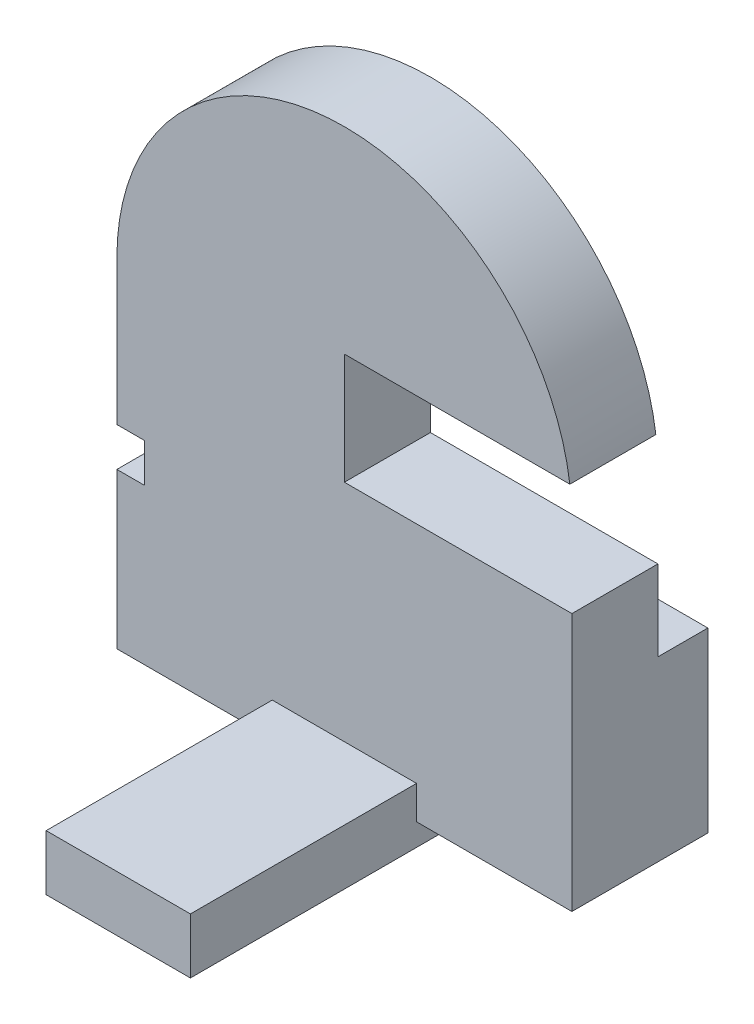
ISO-10303-21;
HEADER;
FILE_DESCRIPTION(('STEP AP214'),'2;1');
FILE_NAME('part.step','',(''),(''),'','','');
FILE_SCHEMA(('AUTOMOTIVE_DESIGN { 1 0 10303 214 1 1 1 1 }'));
ENDSEC;
DATA;
#1=APPLICATION_CONTEXT('core data for automotive mechanical design processes');
#2=APPLICATION_PROTOCOL_DEFINITION('international standard','automotive_design',2000,#1);
#3=PRODUCT_CONTEXT('',#1,'mechanical');
#4=PRODUCT('Part','Part','',(#3));
#5=PRODUCT_RELATED_PRODUCT_CATEGORY('part','',(#4));
#6=PRODUCT_DEFINITION_FORMATION('','',#4);
#7=PRODUCT_DEFINITION_CONTEXT('part definition',#1,'design');
#8=PRODUCT_DEFINITION('design','',#6,#7);
#9=PRODUCT_DEFINITION_SHAPE('','',#8);
#10=(LENGTH_UNIT() NAMED_UNIT(*) SI_UNIT(.MILLI.,.METRE.));
#11=(NAMED_UNIT(*) PLANE_ANGLE_UNIT() SI_UNIT($,.RADIAN.));
#12=(NAMED_UNIT(*) SI_UNIT($,.STERADIAN.) SOLID_ANGLE_UNIT());
#13=UNCERTAINTY_MEASURE_WITH_UNIT(LENGTH_MEASURE(1.E-05),#10,'distance_accuracy_value','');
#14=(GEOMETRIC_REPRESENTATION_CONTEXT(3) GLOBAL_UNCERTAINTY_ASSIGNED_CONTEXT((#13)) GLOBAL_UNIT_ASSIGNED_CONTEXT((#10,
#11,#12)) REPRESENTATION_CONTEXT('',''));
#15=CARTESIAN_POINT('',(0.,0.,0.));
#16=DIRECTION('',(0.,0.,1.));
#17=DIRECTION('',(1.,0.,0.));
#18=AXIS2_PLACEMENT_3D('',#15,#16,#17);
#19=CARTESIAN_POINT('',(-1.3,0.,-15.2));
#20=DIRECTION('',(0.,1.,0.));
#21=DIRECTION('',(0.,0.,1.));
#22=AXIS2_PLACEMENT_3D('',#19,#20,#21);
#23=PLANE('',#22);
#24=DIRECTION('',(0.,0.,1.));
#25=VECTOR('',#24,1.);
#26=CARTESIAN_POINT('',(1.3,0.,-15.2));
#27=LINE('',#26,#25);
#28=CARTESIAN_POINT('',(1.3,0.,-14.3));
#29=VERTEX_POINT('',#28);
#30=CARTESIAN_POINT('',(1.3,0.,-8.675));
#31=VERTEX_POINT('',#30);
#32=EDGE_CURVE('E237',#29,#31,#27,.T.);
#33=ORIENTED_EDGE('',*,*,#32,.T.);
#34=DIRECTION('',(1.,0.,0.));
#35=VECTOR('',#34,1.);
#36=CARTESIAN_POINT('',(-1.3,0.,-8.675));
#37=LINE('',#36,#35);
#38=CARTESIAN_POINT('',(-1.3,0.,-8.675));
#39=VERTEX_POINT('',#38);
#40=EDGE_CURVE('E243',#39,#31,#37,.T.);
#41=ORIENTED_EDGE('',*,*,#40,.F.);
#42=DIRECTION('',(0.,0.,-1.));
#43=VECTOR('',#42,1.);
#44=CARTESIAN_POINT('',(-1.3,0.,-15.2));
#45=LINE('',#44,#43);
#46=CARTESIAN_POINT('',(-1.3,0.,-14.3));
#47=VERTEX_POINT('',#46);
#48=EDGE_CURVE('E245',#39,#47,#45,.T.);
#49=ORIENTED_EDGE('',*,*,#48,.T.);
#50=DIRECTION('',(-1.,0.,0.));
#51=VECTOR('',#50,1.);
#52=CARTESIAN_POINT('',(0.,0.,-14.3));
#53=LINE('',#52,#51);
#54=EDGE_CURVE('E221',#29,#47,#53,.T.);
#55=ORIENTED_EDGE('',*,*,#54,.F.);
#56=EDGE_LOOP('',(#33,#41,#49,#55));
#57=FACE_BOUND('',#56,.T.);
#58=ADVANCED_FACE('F17',(#57),#23,.F.);
#59=CARTESIAN_POINT('',(-1.95,3.6,-14.3));
#60=DIRECTION('',(-1.,0.,0.));
#61=DIRECTION('',(0.,-1.,0.));
#62=AXIS2_PLACEMENT_3D('',#59,#60,#61);
#63=PLANE('',#62);
#64=DIRECTION('',(0.,0.,-1.));
#65=VECTOR('',#64,1.);
#66=CARTESIAN_POINT('',(-1.95,3.6,-14.3));
#67=LINE('',#66,#65);
#68=CARTESIAN_POINT('',(-1.95,3.6,-15.2));
#69=VERTEX_POINT('',#68);
#70=CARTESIAN_POINT('',(-1.95,3.6,-14.3));
#71=VERTEX_POINT('',#70);
#72=EDGE_CURVE('E276',#69,#71,#67,.F.);
#73=ORIENTED_EDGE('',*,*,#72,.T.);
#74=DIRECTION('',(0.,1.,0.));
#75=VECTOR('',#74,1.);
#76=CARTESIAN_POINT('',(-1.95,6.5,-14.3));
#77=LINE('',#76,#75);
#78=CARTESIAN_POINT('',(-1.95,0.4,-14.3));
#79=VERTEX_POINT('',#78);
#80=EDGE_CURVE('E220',#79,#71,#77,.T.);
#81=ORIENTED_EDGE('',*,*,#80,.F.);
#82=DIRECTION('',(0.,0.,1.));
#83=VECTOR('',#82,1.);
#84=CARTESIAN_POINT('',(-1.95,0.4,-14.3));
#85=LINE('',#84,#83);
#86=CARTESIAN_POINT('',(-1.95,0.4,-15.2));
#87=VERTEX_POINT('',#86);
#88=EDGE_CURVE('E281',#87,#79,#85,.T.);
#89=ORIENTED_EDGE('',*,*,#88,.F.);
#90=DIRECTION('',(0.,1.,0.));
#91=VECTOR('',#90,1.);
#92=CARTESIAN_POINT('',(-1.95,6.5,-15.2));
#93=LINE('',#92,#91);
#94=EDGE_CURVE('E226',#69,#87,#93,.F.);
#95=ORIENTED_EDGE('',*,*,#94,.F.);
#96=EDGE_LOOP('',(#73,#81,#89,#95));
#97=FACE_BOUND('',#96,.T.);
#98=ADVANCED_FACE('F476',(#97),#63,.F.);
#99=CARTESIAN_POINT('',(-4.1,3.6,-14.3));
#100=DIRECTION('',(0.,-1.,0.));
#101=DIRECTION('',(0.,0.,-1.));
#102=AXIS2_PLACEMENT_3D('',#99,#100,#101);
#103=PLANE('',#102);
#104=DIRECTION('',(0.,0.,-1.));
#105=VECTOR('',#104,1.);
#106=CARTESIAN_POINT('',(-4.1,3.6,-14.3));
#107=LINE('',#106,#105);
#108=CARTESIAN_POINT('',(-4.1,3.6,-14.3));
#109=VERTEX_POINT('',#108);
#110=CARTESIAN_POINT('',(-4.1,3.6,-15.2));
#111=VERTEX_POINT('',#110);
#112=EDGE_CURVE('E274',#109,#111,#107,.T.);
#113=ORIENTED_EDGE('',*,*,#112,.F.);
#114=DIRECTION('',(-1.,0.,0.));
#115=VECTOR('',#114,1.);
#116=CARTESIAN_POINT('',(0.,3.6,-14.3));
#117=LINE('',#116,#115);
#118=EDGE_CURVE('E216',#71,#109,#117,.T.);
#119=ORIENTED_EDGE('',*,*,#118,.F.);
#120=ORIENTED_EDGE('',*,*,#72,.F.);
#121=DIRECTION('',(-1.,0.,0.));
#122=VECTOR('',#121,1.);
#123=CARTESIAN_POINT('',(0.,3.6,-15.2));
#124=LINE('',#123,#122);
#125=EDGE_CURVE('E233',#111,#69,#124,.F.);
#126=ORIENTED_EDGE('',*,*,#125,.F.);
#127=EDGE_LOOP('',(#113,#119,#120,#126));
#128=FACE_BOUND('',#127,.T.);
#129=ADVANCED_FACE('F474',(#128),#103,.F.);
#130=CARTESIAN_POINT('',(4.1,3.6,-14.3));
#131=DIRECTION('',(0.,-1.,0.));
#132=DIRECTION('',(0.,0.,-1.));
#133=AXIS2_PLACEMENT_3D('',#130,#131,#132);
#134=PLANE('',#133);
#135=DIRECTION('',(0.,0.,1.));
#136=VECTOR('',#135,1.);
#137=CARTESIAN_POINT('',(1.95,3.6,-14.3));
#138=LINE('',#137,#136);
#139=CARTESIAN_POINT('',(1.95,3.6,-15.2));
#140=VERTEX_POINT('',#139);
#141=CARTESIAN_POINT('',(1.95,3.6,-14.3));
#142=VERTEX_POINT('',#141);
#143=EDGE_CURVE('E259',#140,#142,#138,.T.);
#144=ORIENTED_EDGE('',*,*,#143,.T.);
#145=DIRECTION('',(-1.,0.,0.));
#146=VECTOR('',#145,1.);
#147=CARTESIAN_POINT('',(0.,3.6,-14.3));
#148=LINE('',#147,#146);
#149=CARTESIAN_POINT('',(4.1,3.6,-14.3));
#150=VERTEX_POINT('',#149);
#151=EDGE_CURVE('E214',#150,#142,#148,.T.);
#152=ORIENTED_EDGE('',*,*,#151,.F.);
#153=DIRECTION('',(0.,0.,-1.));
#154=VECTOR('',#153,1.);
#155=CARTESIAN_POINT('',(4.1,3.6,-14.3));
#156=LINE('',#155,#154);
#157=CARTESIAN_POINT('',(4.1,3.6,-15.2));
#158=VERTEX_POINT('',#157);
#159=EDGE_CURVE('E271',#158,#150,#156,.F.);
#160=ORIENTED_EDGE('',*,*,#159,.F.);
#161=DIRECTION('',(-1.,0.,0.));
#162=VECTOR('',#161,1.);
#163=CARTESIAN_POINT('',(0.,3.6,-15.2));
#164=LINE('',#163,#162);
#165=EDGE_CURVE('E254',#140,#158,#164,.F.);
#166=ORIENTED_EDGE('',*,*,#165,.F.);
#167=EDGE_LOOP('',(#144,#152,#160,#166));
#168=FACE_BOUND('',#167,.T.);
#169=ADVANCED_FACE('F449',(#168),#134,.F.);
#170=CARTESIAN_POINT('',(1.95,3.6,-14.3));
#171=DIRECTION('',(1.,0.,0.));
#172=DIRECTION('',(0.,1.,0.));
#173=AXIS2_PLACEMENT_3D('',#170,#171,#172);
#174=PLANE('',#173);
#175=ORIENTED_EDGE('',*,*,#143,.F.);
#176=DIRECTION('',(0.,1.,0.));
#177=VECTOR('',#176,1.);
#178=CARTESIAN_POINT('',(1.95,6.5,-15.2));
#179=LINE('',#178,#177);
#180=CARTESIAN_POINT('',(1.95,0.4,-15.2));
#181=VERTEX_POINT('',#180);
#182=EDGE_CURVE('E257',#181,#140,#179,.T.);
#183=ORIENTED_EDGE('',*,*,#182,.F.);
#184=DIRECTION('',(0.,0.,1.));
#185=VECTOR('',#184,1.);
#186=CARTESIAN_POINT('',(1.95,0.4,-14.3));
#187=LINE('',#186,#185);
#188=CARTESIAN_POINT('',(1.95,0.4,-14.3));
#189=VERTEX_POINT('',#188);
#190=EDGE_CURVE('E268',#189,#181,#187,.F.);
#191=ORIENTED_EDGE('',*,*,#190,.F.);
#192=DIRECTION('',(0.,1.,0.));
#193=VECTOR('',#192,1.);
#194=CARTESIAN_POINT('',(1.95,6.5,-14.3));
#195=LINE('',#194,#193);
#196=EDGE_CURVE('E180',#142,#189,#195,.F.);
#197=ORIENTED_EDGE('',*,*,#196,.F.);
#198=EDGE_LOOP('',(#175,#183,#191,#197));
#199=FACE_BOUND('',#198,.T.);
#200=ADVANCED_FACE('F536',(#199),#174,.F.);
#201=CARTESIAN_POINT('',(0.,6.5,-15.2));
#202=DIRECTION('',(0.,0.,-1.));
#203=DIRECTION('',(-1.,0.,0.));
#204=AXIS2_PLACEMENT_3D('',#201,#202,#203);
#205=PLANE('',#204);
#206=DIRECTION('',(0.,-1.,0.));
#207=VECTOR('',#206,1.);
#208=CARTESIAN_POINT('',(4.1,5.05,-15.2));
#209=LINE('',#208,#207);
#210=CARTESIAN_POINT('',(4.1,0.4,-15.2));
#211=VERTEX_POINT('',#210);
#212=EDGE_CURVE('E345',#158,#211,#209,.T.);
#213=ORIENTED_EDGE('',*,*,#212,.T.);
#214=DIRECTION('',(1.,0.,0.));
#215=VECTOR('',#214,1.);
#216=CARTESIAN_POINT('',(4.1,0.4,-15.2));
#217=LINE('',#216,#215);
#218=EDGE_CURVE('E336',#211,#181,#217,.F.);
#219=ORIENTED_EDGE('',*,*,#218,.T.);
#220=ORIENTED_EDGE('',*,*,#182,.T.);
#221=ORIENTED_EDGE('',*,*,#165,.T.);
#222=EDGE_LOOP('',(#213,#219,#220,#221));
#223=FACE_BOUND('',#222,.T.);
#224=ADVANCED_FACE('F533',(#223),#205,.T.);
#225=CARTESIAN_POINT('',(-1.3,0.,-15.2));
#226=DIRECTION('',(1.,0.,0.));
#227=DIRECTION('',(0.,0.,-1.));
#228=AXIS2_PLACEMENT_3D('',#225,#226,#227);
#229=PLANE('',#228);
#230=ORIENTED_EDGE('',*,*,#48,.F.);
#231=DIRECTION('',(0.,1.,0.));
#232=VECTOR('',#231,1.);
#233=CARTESIAN_POINT('',(-1.3,1.,-8.675));
#234=LINE('',#233,#232);
#235=CARTESIAN_POINT('',(-1.3,1.,-8.675));
#236=VERTEX_POINT('',#235);
#237=EDGE_CURVE('E240',#236,#39,#234,.F.);
#238=ORIENTED_EDGE('',*,*,#237,.F.);
#239=DIRECTION('',(0.,0.,1.));
#240=VECTOR('',#239,1.);
#241=CARTESIAN_POINT('',(-1.3,1.,-8.675));
#242=LINE('',#241,#240);
#243=CARTESIAN_POINT('',(-1.3,1.,-12.75));
#244=VERTEX_POINT('',#243);
#245=EDGE_CURVE('E330',#244,#236,#242,.T.);
#246=ORIENTED_EDGE('',*,*,#245,.F.);
#247=DIRECTION('',(0.,1.,0.));
#248=VECTOR('',#247,1.);
#249=CARTESIAN_POINT('',(-1.3,0.,-12.75));
#250=LINE('',#249,#248);
#251=CARTESIAN_POINT('',(-1.3,0.4,-12.75));
#252=VERTEX_POINT('',#251);
#253=EDGE_CURVE('E248',#252,#244,#250,.T.);
#254=ORIENTED_EDGE('',*,*,#253,.F.);
#255=DIRECTION('',(0.,0.,-1.));
#256=VECTOR('',#255,1.);
#257=CARTESIAN_POINT('',(-1.3,0.4,-15.2));
#258=LINE('',#257,#256);
#259=CARTESIAN_POINT('',(-1.3,0.4,-14.3));
#260=VERTEX_POINT('',#259);
#261=EDGE_CURVE('E251',#260,#252,#258,.F.);
#262=ORIENTED_EDGE('',*,*,#261,.F.);
#263=DIRECTION('',(0.,1.,0.));
#264=VECTOR('',#263,1.);
#265=CARTESIAN_POINT('',(-1.3,6.5,-14.3));
#266=LINE('',#265,#264);
#267=EDGE_CURVE('E217',#47,#260,#266,.T.);
#268=ORIENTED_EDGE('',*,*,#267,.F.);
#269=EDGE_LOOP('',(#230,#238,#246,#254,#262,#268));
#270=FACE_BOUND('',#269,.T.);
#271=ADVANCED_FACE('F404',(#270),#229,.F.);
#272=CARTESIAN_POINT('',(-1.3,1.,-8.675));
#273=DIRECTION('',(0.,0.,1.));
#274=DIRECTION('',(1.,0.,0.));
#275=AXIS2_PLACEMENT_3D('',#272,#273,#274);
#276=PLANE('',#275);
#277=DIRECTION('',(1.,0.,0.));
#278=VECTOR('',#277,1.);
#279=CARTESIAN_POINT('',(-1.3,1.,-8.675));
#280=LINE('',#279,#278);
#281=CARTESIAN_POINT('',(1.3,1.,-8.675));
#282=VERTEX_POINT('',#281);
#283=EDGE_CURVE('E327',#236,#282,#280,.T.);
#284=ORIENTED_EDGE('',*,*,#283,.F.);
#285=ORIENTED_EDGE('',*,*,#237,.T.);
#286=ORIENTED_EDGE('',*,*,#40,.T.);
#287=DIRECTION('',(0.,1.,0.));
#288=VECTOR('',#287,1.);
#289=CARTESIAN_POINT('',(1.3,0.,-8.675));
#290=LINE('',#289,#288);
#291=EDGE_CURVE('E234',#31,#282,#290,.T.);
#292=ORIENTED_EDGE('',*,*,#291,.T.);
#293=EDGE_LOOP('',(#284,#285,#286,#292));
#294=FACE_BOUND('',#293,.T.);
#295=ADVANCED_FACE('F416',(#294),#276,.T.);
#296=CARTESIAN_POINT('',(1.3,0.,-15.2));
#297=DIRECTION('',(-1.,0.,0.));
#298=DIRECTION('',(0.,0.,1.));
#299=AXIS2_PLACEMENT_3D('',#296,#297,#298);
#300=PLANE('',#299);
#301=DIRECTION('',(0.,0.,1.));
#302=VECTOR('',#301,1.);
#303=CARTESIAN_POINT('',(1.3,0.4,-15.2));
#304=LINE('',#303,#302);
#305=CARTESIAN_POINT('',(1.3,0.4,-14.3));
#306=VERTEX_POINT('',#305);
#307=CARTESIAN_POINT('',(1.3,0.4,-12.75));
#308=VERTEX_POINT('',#307);
#309=EDGE_CURVE('E342',#306,#308,#304,.T.);
#310=ORIENTED_EDGE('',*,*,#309,.T.);
#311=DIRECTION('',(0.,1.,0.));
#312=VECTOR('',#311,1.);
#313=CARTESIAN_POINT('',(1.3,0.,-12.75));
#314=LINE('',#313,#312);
#315=CARTESIAN_POINT('',(1.3,1.,-12.75));
#316=VERTEX_POINT('',#315);
#317=EDGE_CURVE('E230',#316,#308,#314,.F.);
#318=ORIENTED_EDGE('',*,*,#317,.F.);
#319=DIRECTION('',(0.,0.,1.));
#320=VECTOR('',#319,1.);
#321=CARTESIAN_POINT('',(1.3,1.,-8.675));
#322=LINE('',#321,#320);
#323=EDGE_CURVE('E294',#282,#316,#322,.F.);
#324=ORIENTED_EDGE('',*,*,#323,.F.);
#325=ORIENTED_EDGE('',*,*,#291,.F.);
#326=ORIENTED_EDGE('',*,*,#32,.F.);
#327=DIRECTION('',(0.,1.,0.));
#328=VECTOR('',#327,1.);
#329=CARTESIAN_POINT('',(1.3,6.5,-14.3));
#330=LINE('',#329,#328);
#331=EDGE_CURVE('E223',#306,#29,#330,.F.);
#332=ORIENTED_EDGE('',*,*,#331,.F.);
#333=EDGE_LOOP('',(#310,#318,#324,#325,#326,#332));
#334=FACE_BOUND('',#333,.T.);
#335=ADVANCED_FACE('F461',(#334),#300,.F.);
#336=CARTESIAN_POINT('',(0.,6.5,-15.2));
#337=DIRECTION('',(0.,0.,-1.));
#338=DIRECTION('',(-1.,0.,0.));
#339=AXIS2_PLACEMENT_3D('',#336,#337,#338);
#340=PLANE('',#339);
#341=DIRECTION('',(1.,0.,0.));
#342=VECTOR('',#341,1.);
#343=CARTESIAN_POINT('',(-1.3,0.4,-15.2));
#344=LINE('',#343,#342);
#345=CARTESIAN_POINT('',(-4.1,0.4,-15.2));
#346=VERTEX_POINT('',#345);
#347=EDGE_CURVE('E293',#87,#346,#344,.F.);
#348=ORIENTED_EDGE('',*,*,#347,.T.);
#349=DIRECTION('',(0.,1.,0.));
#350=VECTOR('',#349,1.);
#351=CARTESIAN_POINT('',(-4.1,0.4,-15.2));
#352=LINE('',#351,#350);
#353=EDGE_CURVE('E209',#346,#111,#352,.T.);
#354=ORIENTED_EDGE('',*,*,#353,.T.);
#355=ORIENTED_EDGE('',*,*,#125,.T.);
#356=ORIENTED_EDGE('',*,*,#94,.T.);
#357=EDGE_LOOP('',(#348,#354,#355,#356));
#358=FACE_BOUND('',#357,.T.);
#359=ADVANCED_FACE('F469',(#358),#340,.T.);
#360=CARTESIAN_POINT('',(0.,6.5,-14.3));
#361=DIRECTION('',(0.,0.,-1.));
#362=DIRECTION('',(-1.,0.,0.));
#363=AXIS2_PLACEMENT_3D('',#360,#361,#362);
#364=PLANE('',#363);
#365=ORIENTED_EDGE('',*,*,#151,.T.);
#366=ORIENTED_EDGE('',*,*,#196,.T.);
#367=DIRECTION('',(1.,0.,0.));
#368=VECTOR('',#367,1.);
#369=CARTESIAN_POINT('',(4.1,0.4,-14.3));
#370=LINE('',#369,#368);
#371=EDGE_CURVE('E333',#189,#306,#370,.F.);
#372=ORIENTED_EDGE('',*,*,#371,.T.);
#373=ORIENTED_EDGE('',*,*,#331,.T.);
#374=ORIENTED_EDGE('',*,*,#54,.T.);
#375=ORIENTED_EDGE('',*,*,#267,.T.);
#376=DIRECTION('',(1.,0.,0.));
#377=VECTOR('',#376,1.);
#378=CARTESIAN_POINT('',(-1.3,0.4,-14.3));
#379=LINE('',#378,#377);
#380=EDGE_CURVE('E290',#260,#79,#379,.F.);
#381=ORIENTED_EDGE('',*,*,#380,.T.);
#382=ORIENTED_EDGE('',*,*,#80,.T.);
#383=ORIENTED_EDGE('',*,*,#118,.T.);
#384=DIRECTION('',(0.,1.,0.));
#385=VECTOR('',#384,1.);
#386=CARTESIAN_POINT('',(-4.1,0.4,-14.3));
#387=LINE('',#386,#385);
#388=CARTESIAN_POINT('',(-4.1,6.5,-14.3));
#389=VERTEX_POINT('',#388);
#390=EDGE_CURVE('E124',#109,#389,#387,.T.);
#391=ORIENTED_EDGE('',*,*,#390,.T.);
#392=CARTESIAN_POINT('',(0.,6.5,-14.3));
#393=DIRECTION('',(0.,0.,-1.));
#394=DIRECTION('',(-1.,0.,0.));
#395=AXIS2_PLACEMENT_3D('',#392,#393,#394);
#396=CIRCLE('',#395,4.1);
#397=CARTESIAN_POINT('',(4.06294228361682,7.05,-14.3));
#398=VERTEX_POINT('',#397);
#399=EDGE_CURVE('E20',#398,#389,#396,.F.);
#400=ORIENTED_EDGE('',*,*,#399,.F.);
#401=DIRECTION('',(1.,0.,0.));
#402=VECTOR('',#401,1.);
#403=CARTESIAN_POINT('',(0.,7.05,-14.3));
#404=LINE('',#403,#402);
#405=CARTESIAN_POINT('',(0.,7.05,-14.3));
#406=VERTEX_POINT('',#405);
#407=EDGE_CURVE('E120',#398,#406,#404,.F.);
#408=ORIENTED_EDGE('',*,*,#407,.T.);
#409=DIRECTION('',(0.,-1.,0.));
#410=VECTOR('',#409,1.);
#411=CARTESIAN_POINT('',(0.,7.05,-14.3));
#412=LINE('',#411,#410);
#413=CARTESIAN_POINT('',(0.,5.05,-14.3));
#414=VERTEX_POINT('',#413);
#415=EDGE_CURVE('E154',#406,#414,#412,.T.);
#416=ORIENTED_EDGE('',*,*,#415,.T.);
#417=DIRECTION('',(1.,0.,0.));
#418=VECTOR('',#417,1.);
#419=CARTESIAN_POINT('',(0.,5.05,-14.3));
#420=LINE('',#419,#418);
#421=CARTESIAN_POINT('',(4.1,5.05,-14.3));
#422=VERTEX_POINT('',#421);
#423=EDGE_CURVE('E353',#414,#422,#420,.T.);
#424=ORIENTED_EDGE('',*,*,#423,.T.);
#425=DIRECTION('',(0.,-1.,0.));
#426=VECTOR('',#425,1.);
#427=CARTESIAN_POINT('',(4.1,5.05,-14.3));
#428=LINE('',#427,#426);
#429=EDGE_CURVE('E348',#422,#150,#428,.T.);
#430=ORIENTED_EDGE('',*,*,#429,.T.);
#431=EDGE_LOOP('',(#365,#366,#372,#373,#374,#375,#381,#382,#383,#391,#400,#408,#416,#424,#430));
#432=FACE_BOUND('',#431,.T.);
#433=ADVANCED_FACE('F118',(#432),#364,.T.);
#434=CARTESIAN_POINT('',(-3.6,3.9,-13.75));
#435=DIRECTION('',(0.,0.,-1.));
#436=DIRECTION('',(0.,1.,0.));
#437=AXIS2_PLACEMENT_3D('',#434,#435,#436);
#438=PLANE('',#437);
#439=DIRECTION('',(1.,0.,0.));
#440=VECTOR('',#439,1.);
#441=CARTESIAN_POINT('',(-3.6,3.2,-13.75));
#442=LINE('',#441,#440);
#443=CARTESIAN_POINT('',(-4.1,3.2,-13.75));
#444=VERTEX_POINT('',#443);
#445=CARTESIAN_POINT('',(-3.6,3.2,-13.75));
#446=VERTEX_POINT('',#445);
#447=EDGE_CURVE('E191',#444,#446,#442,.T.);
#448=ORIENTED_EDGE('',*,*,#447,.T.);
#449=DIRECTION('',(0.,1.,0.));
#450=VECTOR('',#449,1.);
#451=CARTESIAN_POINT('',(-3.6,3.2,-13.75));
#452=LINE('',#451,#450);
#453=CARTESIAN_POINT('',(-3.6,3.9,-13.75));
#454=VERTEX_POINT('',#453);
#455=EDGE_CURVE('E174',#446,#454,#452,.T.);
#456=ORIENTED_EDGE('',*,*,#455,.T.);
#457=DIRECTION('',(1.,0.,0.));
#458=VECTOR('',#457,1.);
#459=CARTESIAN_POINT('',(-3.6,3.9,-13.75));
#460=LINE('',#459,#458);
#461=CARTESIAN_POINT('',(-4.1,3.9,-13.75));
#462=VERTEX_POINT('',#461);
#463=EDGE_CURVE('E129',#454,#462,#460,.F.);
#464=ORIENTED_EDGE('',*,*,#463,.T.);
#465=DIRECTION('',(0.,1.,0.));
#466=VECTOR('',#465,1.);
#467=CARTESIAN_POINT('',(-4.1,0.4,-13.75));
#468=LINE('',#467,#466);
#469=EDGE_CURVE('E162',#462,#444,#468,.F.);
#470=ORIENTED_EDGE('',*,*,#469,.T.);
#471=EDGE_LOOP('',(#448,#456,#464,#470));
#472=FACE_BOUND('',#471,.T.);
#473=ADVANCED_FACE('F518',(#472),#438,.F.);
#474=CARTESIAN_POINT('',(-3.6,3.9,-12.75));
#475=DIRECTION('',(0.,1.,0.));
#476=DIRECTION('',(0.,0.,1.));
#477=AXIS2_PLACEMENT_3D('',#474,#475,#476);
#478=PLANE('',#477);
#479=ORIENTED_EDGE('',*,*,#463,.F.);
#480=DIRECTION('',(0.,0.,-1.));
#481=VECTOR('',#480,1.);
#482=CARTESIAN_POINT('',(-3.6,3.9,-12.75));
#483=LINE('',#482,#481);
#484=CARTESIAN_POINT('',(-3.6,3.9,-12.75));
#485=VERTEX_POINT('',#484);
#486=EDGE_CURVE('E169',#454,#485,#483,.F.);
#487=ORIENTED_EDGE('',*,*,#486,.T.);
#488=DIRECTION('',(-1.,0.,0.));
#489=VECTOR('',#488,1.);
#490=CARTESIAN_POINT('',(0.,3.9,-12.75));
#491=LINE('',#490,#489);
#492=CARTESIAN_POINT('',(-4.1,3.9,-12.75));
#493=VERTEX_POINT('',#492);
#494=EDGE_CURVE('E165',#485,#493,#491,.T.);
#495=ORIENTED_EDGE('',*,*,#494,.T.);
#496=DIRECTION('',(0.,0.,-1.));
#497=VECTOR('',#496,1.);
#498=CARTESIAN_POINT('',(-4.1,3.9,-15.2));
#499=LINE('',#498,#497);
#500=EDGE_CURVE('E159',#493,#462,#499,.T.);
#501=ORIENTED_EDGE('',*,*,#500,.T.);
#502=EDGE_LOOP('',(#479,#487,#495,#501));
#503=FACE_BOUND('',#502,.T.);
#504=ADVANCED_FACE('F515',(#503),#478,.F.);
#505=CARTESIAN_POINT('',(0.,6.5,-15.2));
#506=DIRECTION('',(0.,0.,-1.));
#507=DIRECTION('',(-1.,0.,0.));
#508=AXIS2_PLACEMENT_3D('',#505,#506,#507);
#509=CYLINDRICAL_SURFACE('',#508,4.1);
#510=CARTESIAN_POINT('',(0.,6.5,-12.75));
#511=DIRECTION('',(0.,0.,-1.));
#512=DIRECTION('',(-1.,0.,0.));
#513=AXIS2_PLACEMENT_3D('',#510,#511,#512);
#514=CIRCLE('',#513,4.1);
#515=CARTESIAN_POINT('',(-4.1,6.5,-12.75));
#516=VERTEX_POINT('',#515);
#517=CARTESIAN_POINT('',(4.06294228361682,7.05,-12.75));
#518=VERTEX_POINT('',#517);
#519=EDGE_CURVE('E140',#516,#518,#514,.T.);
#520=ORIENTED_EDGE('',*,*,#519,.T.);
#521=DIRECTION('',(0.,0.,1.));
#522=VECTOR('',#521,1.);
#523=CARTESIAN_POINT('',(4.062942283617,7.05,-15.2));
#524=LINE('',#523,#522);
#525=EDGE_CURVE('E128',#518,#398,#524,.F.);
#526=ORIENTED_EDGE('',*,*,#525,.T.);
#527=ORIENTED_EDGE('',*,*,#399,.T.);
#528=DIRECTION('',(0.,0.,-1.));
#529=VECTOR('',#528,1.);
#530=CARTESIAN_POINT('',(-4.1,6.5,-15.2));
#531=LINE('',#530,#529);
#532=EDGE_CURVE('E157',#389,#516,#531,.F.);
#533=ORIENTED_EDGE('',*,*,#532,.T.);
#534=EDGE_LOOP('',(#520,#526,#527,#533));
#535=FACE_BOUND('',#534,.T.);
#536=ADVANCED_FACE('F138',(#535),#509,.T.);
#537=CARTESIAN_POINT('',(0.,7.05,-15.2));
#538=DIRECTION('',(0.,1.,0.));
#539=DIRECTION('',(0.,0.,1.));
#540=AXIS2_PLACEMENT_3D('',#537,#538,#539);
#541=PLANE('',#540);
#542=ORIENTED_EDGE('',*,*,#525,.F.);
#543=DIRECTION('',(-1.,0.,0.));
#544=VECTOR('',#543,1.);
#545=CARTESIAN_POINT('',(0.,7.05,-12.75));
#546=LINE('',#545,#544);
#547=CARTESIAN_POINT('',(0.,7.05,-12.75));
#548=VERTEX_POINT('',#547);
#549=EDGE_CURVE('E150',#518,#548,#546,.T.);
#550=ORIENTED_EDGE('',*,*,#549,.T.);
#551=DIRECTION('',(0.,0.,1.));
#552=VECTOR('',#551,1.);
#553=CARTESIAN_POINT('',(0.,7.05,-15.2));
#554=LINE('',#553,#552);
#555=EDGE_CURVE('E135',#548,#406,#554,.F.);
#556=ORIENTED_EDGE('',*,*,#555,.T.);
#557=ORIENTED_EDGE('',*,*,#407,.F.);
#558=EDGE_LOOP('',(#542,#550,#556,#557));
#559=FACE_BOUND('',#558,.T.);
#560=ADVANCED_FACE('F132',(#559),#541,.F.);
#561=CARTESIAN_POINT('',(0.,7.05,-15.2));
#562=DIRECTION('',(-1.,0.,0.));
#563=DIRECTION('',(0.,-1.,0.));
#564=AXIS2_PLACEMENT_3D('',#561,#562,#563);
#565=PLANE('',#564);
#566=ORIENTED_EDGE('',*,*,#555,.F.);
#567=DIRECTION('',(0.,1.,0.));
#568=VECTOR('',#567,1.);
#569=CARTESIAN_POINT('',(0.,6.5,-12.75));
#570=LINE('',#569,#568);
#571=CARTESIAN_POINT('',(0.,5.05,-12.75));
#572=VERTEX_POINT('',#571);
#573=EDGE_CURVE('E146',#548,#572,#570,.F.);
#574=ORIENTED_EDGE('',*,*,#573,.T.);
#575=DIRECTION('',(0.,0.,1.));
#576=VECTOR('',#575,1.);
#577=CARTESIAN_POINT('',(0.,5.05,-15.2));
#578=LINE('',#577,#576);
#579=EDGE_CURVE('E144',#572,#414,#578,.F.);
#580=ORIENTED_EDGE('',*,*,#579,.T.);
#581=ORIENTED_EDGE('',*,*,#415,.F.);
#582=EDGE_LOOP('',(#566,#574,#580,#581));
#583=FACE_BOUND('',#582,.T.);
#584=ADVANCED_FACE('F361',(#583),#565,.F.);
#585=CARTESIAN_POINT('',(0.,5.05,-15.2));
#586=DIRECTION('',(0.,-1.,0.));
#587=DIRECTION('',(1.,0.,0.));
#588=AXIS2_PLACEMENT_3D('',#585,#586,#587);
#589=PLANE('',#588);
#590=ORIENTED_EDGE('',*,*,#579,.F.);
#591=DIRECTION('',(-1.,0.,0.));
#592=VECTOR('',#591,1.);
#593=CARTESIAN_POINT('',(0.,5.05,-12.75));
#594=LINE('',#593,#592);
#595=CARTESIAN_POINT('',(4.1,5.05,-12.75));
#596=VERTEX_POINT('',#595);
#597=EDGE_CURVE('E149',#572,#596,#594,.F.);
#598=ORIENTED_EDGE('',*,*,#597,.T.);
#599=DIRECTION('',(0.,0.,1.));
#600=VECTOR('',#599,1.);
#601=CARTESIAN_POINT('',(4.1,5.05,-15.2));
#602=LINE('',#601,#600);
#603=EDGE_CURVE('E351',#596,#422,#602,.F.);
#604=ORIENTED_EDGE('',*,*,#603,.T.);
#605=ORIENTED_EDGE('',*,*,#423,.F.);
#606=EDGE_LOOP('',(#590,#598,#604,#605));
#607=FACE_BOUND('',#606,.T.);
#608=ADVANCED_FACE('F366',(#607),#589,.F.);
#609=CARTESIAN_POINT('',(4.1,5.05,-15.2));
#610=DIRECTION('',(-1.,0.,0.));
#611=DIRECTION('',(0.,-1.,0.));
#612=AXIS2_PLACEMENT_3D('',#609,#610,#611);
#613=PLANE('',#612);
#614=ORIENTED_EDGE('',*,*,#159,.T.);
#615=ORIENTED_EDGE('',*,*,#429,.F.);
#616=ORIENTED_EDGE('',*,*,#603,.F.);
#617=DIRECTION('',(0.,1.,0.));
#618=VECTOR('',#617,1.);
#619=CARTESIAN_POINT('',(4.1,6.5,-12.75));
#620=LINE('',#619,#618);
#621=CARTESIAN_POINT('',(4.1,0.4,-12.75));
#622=VERTEX_POINT('',#621);
#623=EDGE_CURVE('E375',#596,#622,#620,.F.);
#624=ORIENTED_EDGE('',*,*,#623,.T.);
#625=DIRECTION('',(0.,0.,1.));
#626=VECTOR('',#625,1.);
#627=CARTESIAN_POINT('',(4.1,0.4,-15.2));
#628=LINE('',#627,#626);
#629=EDGE_CURVE('E339',#622,#211,#628,.F.);
#630=ORIENTED_EDGE('',*,*,#629,.T.);
#631=ORIENTED_EDGE('',*,*,#212,.F.);
#632=EDGE_LOOP('',(#614,#615,#616,#624,#630,#631));
#633=FACE_BOUND('',#632,.T.);
#634=ADVANCED_FACE('F445',(#633),#613,.F.);
#635=CARTESIAN_POINT('',(4.1,0.4,-15.2));
#636=DIRECTION('',(0.,1.,0.));
#637=DIRECTION('',(0.,0.,1.));
#638=AXIS2_PLACEMENT_3D('',#635,#636,#637);
#639=PLANE('',#638);
#640=ORIENTED_EDGE('',*,*,#190,.T.);
#641=ORIENTED_EDGE('',*,*,#218,.F.);
#642=ORIENTED_EDGE('',*,*,#629,.F.);
#643=DIRECTION('',(-1.,0.,0.));
#644=VECTOR('',#643,1.);
#645=CARTESIAN_POINT('',(0.,0.4,-12.75));
#646=LINE('',#645,#644);
#647=EDGE_CURVE('E377',#622,#308,#646,.T.);
#648=ORIENTED_EDGE('',*,*,#647,.T.);
#649=ORIENTED_EDGE('',*,*,#309,.F.);
#650=ORIENTED_EDGE('',*,*,#371,.F.);
#651=EDGE_LOOP('',(#640,#641,#642,#648,#649,#650));
#652=FACE_BOUND('',#651,.T.);
#653=ADVANCED_FACE('F454',(#652),#639,.F.);
#654=CARTESIAN_POINT('',(-1.3,1.,-8.675));
#655=DIRECTION('',(0.,1.,0.));
#656=DIRECTION('',(0.,0.,1.));
#657=AXIS2_PLACEMENT_3D('',#654,#655,#656);
#658=PLANE('',#657);
#659=ORIENTED_EDGE('',*,*,#283,.T.);
#660=ORIENTED_EDGE('',*,*,#323,.T.);
#661=DIRECTION('',(-1.,0.,0.));
#662=VECTOR('',#661,1.);
#663=CARTESIAN_POINT('',(0.,1.,-12.75));
#664=LINE('',#663,#662);
#665=EDGE_CURVE('E382',#316,#244,#664,.T.);
#666=ORIENTED_EDGE('',*,*,#665,.T.);
#667=ORIENTED_EDGE('',*,*,#245,.T.);
#668=EDGE_LOOP('',(#659,#660,#666,#667));
#669=FACE_BOUND('',#668,.T.);
#670=ADVANCED_FACE('F422',(#669),#658,.T.);
#671=CARTESIAN_POINT('',(-1.3,0.4,-15.2));
#672=DIRECTION('',(0.,1.,0.));
#673=DIRECTION('',(0.,0.,1.));
#674=AXIS2_PLACEMENT_3D('',#671,#672,#673);
#675=PLANE('',#674);
#676=ORIENTED_EDGE('',*,*,#88,.T.);
#677=ORIENTED_EDGE('',*,*,#380,.F.);
#678=ORIENTED_EDGE('',*,*,#261,.T.);
#679=DIRECTION('',(-1.,0.,0.));
#680=VECTOR('',#679,1.);
#681=CARTESIAN_POINT('',(0.,0.4,-12.75));
#682=LINE('',#681,#680);
#683=CARTESIAN_POINT('',(-4.1,0.4,-12.75));
#684=VERTEX_POINT('',#683);
#685=EDGE_CURVE('E385',#252,#684,#682,.T.);
#686=ORIENTED_EDGE('',*,*,#685,.T.);
#687=DIRECTION('',(0.,0.,-1.));
#688=VECTOR('',#687,1.);
#689=CARTESIAN_POINT('',(-4.1,0.4,-15.2));
#690=LINE('',#689,#688);
#691=EDGE_CURVE('E303',#684,#346,#690,.T.);
#692=ORIENTED_EDGE('',*,*,#691,.T.);
#693=ORIENTED_EDGE('',*,*,#347,.F.);
#694=EDGE_LOOP('',(#676,#677,#678,#686,#692,#693));
#695=FACE_BOUND('',#694,.T.);
#696=ADVANCED_FACE('F398',(#695),#675,.F.);
#697=CARTESIAN_POINT('',(-4.1,0.4,-15.2));
#698=DIRECTION('',(1.,0.,0.));
#699=DIRECTION('',(0.,0.,-1.));
#700=AXIS2_PLACEMENT_3D('',#697,#698,#699);
#701=PLANE('',#700);
#702=DIRECTION('',(0.,0.,1.));
#703=VECTOR('',#702,1.);
#704=CARTESIAN_POINT('',(-4.1,3.2,-12.75));
#705=LINE('',#704,#703);
#706=CARTESIAN_POINT('',(-4.1,3.2,-12.75));
#707=VERTEX_POINT('',#706);
#708=EDGE_CURVE('E188',#707,#444,#705,.F.);
#709=ORIENTED_EDGE('',*,*,#708,.T.);
#710=ORIENTED_EDGE('',*,*,#469,.F.);
#711=ORIENTED_EDGE('',*,*,#500,.F.);
#712=DIRECTION('',(0.,1.,0.));
#713=VECTOR('',#712,1.);
#714=CARTESIAN_POINT('',(-4.1,6.5,-12.75));
#715=LINE('',#714,#713);
#716=EDGE_CURVE('E168',#493,#516,#715,.T.);
#717=ORIENTED_EDGE('',*,*,#716,.T.);
#718=ORIENTED_EDGE('',*,*,#532,.F.);
#719=ORIENTED_EDGE('',*,*,#390,.F.);
#720=ORIENTED_EDGE('',*,*,#112,.T.);
#721=ORIENTED_EDGE('',*,*,#353,.F.);
#722=ORIENTED_EDGE('',*,*,#691,.F.);
#723=DIRECTION('',(0.,1.,0.));
#724=VECTOR('',#723,1.);
#725=CARTESIAN_POINT('',(-4.1,6.5,-12.75));
#726=LINE('',#725,#724);
#727=EDGE_CURVE('E197',#684,#707,#726,.T.);
#728=ORIENTED_EDGE('',*,*,#727,.T.);
#729=EDGE_LOOP('',(#709,#710,#711,#717,#718,#719,#720,#721,#722,#728));
#730=FACE_BOUND('',#729,.T.);
#731=ADVANCED_FACE('F391',(#730),#701,.F.);
#732=CARTESIAN_POINT('',(-3.6,3.2,-12.75));
#733=DIRECTION('',(0.,-1.,0.));
#734=DIRECTION('',(1.,0.,0.));
#735=AXIS2_PLACEMENT_3D('',#732,#733,#734);
#736=PLANE('',#735);
#737=DIRECTION('',(-1.,0.,0.));
#738=VECTOR('',#737,1.);
#739=CARTESIAN_POINT('',(0.,3.2,-12.75));
#740=LINE('',#739,#738);
#741=CARTESIAN_POINT('',(-3.6,3.2,-12.75));
#742=VERTEX_POINT('',#741);
#743=EDGE_CURVE('E26',#707,#742,#740,.F.);
#744=ORIENTED_EDGE('',*,*,#743,.T.);
#745=DIRECTION('',(0.,0.,-1.));
#746=VECTOR('',#745,1.);
#747=CARTESIAN_POINT('',(-3.6,3.2,-12.75));
#748=LINE('',#747,#746);
#749=EDGE_CURVE('E34',#742,#446,#748,.T.);
#750=ORIENTED_EDGE('',*,*,#749,.T.);
#751=ORIENTED_EDGE('',*,*,#447,.F.);
#752=ORIENTED_EDGE('',*,*,#708,.F.);
#753=EDGE_LOOP('',(#744,#750,#751,#752));
#754=FACE_BOUND('',#753,.T.);
#755=ADVANCED_FACE('F491',(#754),#736,.F.);
#756=CARTESIAN_POINT('',(-3.6,3.2,-12.75));
#757=DIRECTION('',(1.,0.,0.));
#758=DIRECTION('',(0.,0.,-1.));
#759=AXIS2_PLACEMENT_3D('',#756,#757,#758);
#760=PLANE('',#759);
#761=ORIENTED_EDGE('',*,*,#486,.F.);
#762=ORIENTED_EDGE('',*,*,#455,.F.);
#763=ORIENTED_EDGE('',*,*,#749,.F.);
#764=DIRECTION('',(0.,1.,0.));
#765=VECTOR('',#764,1.);
#766=CARTESIAN_POINT('',(-3.6,6.5,-12.75));
#767=LINE('',#766,#765);
#768=EDGE_CURVE('E11',#742,#485,#767,.T.);
#769=ORIENTED_EDGE('',*,*,#768,.T.);
#770=EDGE_LOOP('',(#761,#762,#763,#769));
#771=FACE_BOUND('',#770,.T.);
#772=ADVANCED_FACE('F486',(#771),#760,.F.);
#773=CARTESIAN_POINT('',(0.,6.5,-12.75));
#774=DIRECTION('',(0.,0.,-1.));
#775=DIRECTION('',(-1.,0.,0.));
#776=AXIS2_PLACEMENT_3D('',#773,#774,#775);
#777=PLANE('',#776);
#778=ORIENTED_EDGE('',*,*,#743,.F.);
#779=ORIENTED_EDGE('',*,*,#727,.F.);
#780=ORIENTED_EDGE('',*,*,#685,.F.);
#781=ORIENTED_EDGE('',*,*,#253,.T.);
#782=ORIENTED_EDGE('',*,*,#665,.F.);
#783=ORIENTED_EDGE('',*,*,#317,.T.);
#784=ORIENTED_EDGE('',*,*,#647,.F.);
#785=ORIENTED_EDGE('',*,*,#623,.F.);
#786=ORIENTED_EDGE('',*,*,#597,.F.);
#787=ORIENTED_EDGE('',*,*,#573,.F.);
#788=ORIENTED_EDGE('',*,*,#549,.F.);
#789=ORIENTED_EDGE('',*,*,#519,.F.);
#790=ORIENTED_EDGE('',*,*,#716,.F.);
#791=ORIENTED_EDGE('',*,*,#494,.F.);
#792=ORIENTED_EDGE('',*,*,#768,.F.);
#793=EDGE_LOOP('',(#778,#779,#780,#781,#782,#783,#784,#785,#786,#787,#788,#789,#790,#791,#792));
#794=FACE_BOUND('',#793,.T.);
#795=ADVANCED_FACE('F372',(#794),#777,.F.);
#796=CLOSED_SHELL('',(#58,#98,#129,#169,#200,#224,#271,#295,#335,#359,#433,#473,#504,#536,#560,
#584,#608,#634,#653,#670,#696,#731,#755,#772,#795));
#797=MANIFOLD_SOLID_BREP('B1',#796);
#798=ADVANCED_BREP_SHAPE_REPRESENTATION('',(#18,#797),#14);
#799=SHAPE_DEFINITION_REPRESENTATION(#9,#798);
ENDSEC;
END-ISO-10303-21;
